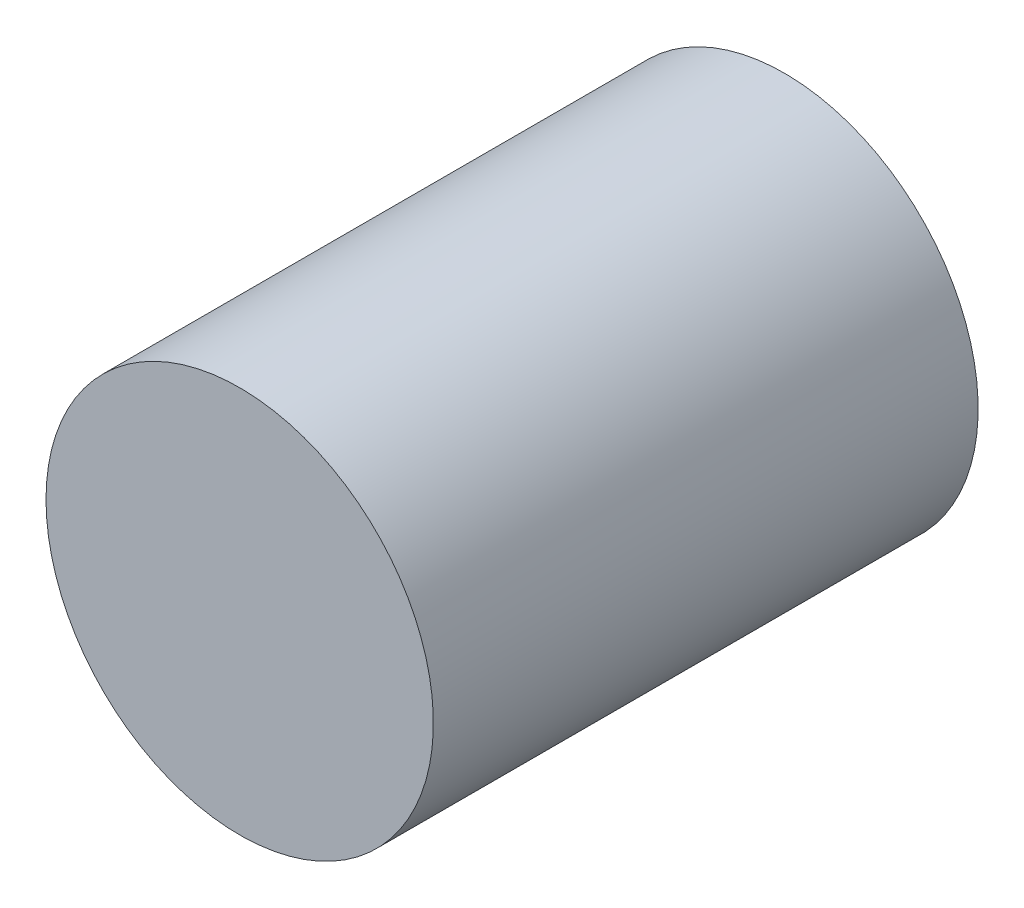
ISO-10303-21;
HEADER;
FILE_DESCRIPTION(('STEP AP214'),'2;1');
FILE_NAME('part.step','',(''),(''),'','','');
FILE_SCHEMA(('AUTOMOTIVE_DESIGN { 1 0 10303 214 1 1 1 1 }'));
ENDSEC;
DATA;
#1=APPLICATION_CONTEXT('core data for automotive mechanical design processes');
#2=APPLICATION_PROTOCOL_DEFINITION('international standard','automotive_design',2000,#1);
#3=PRODUCT_CONTEXT('',#1,'mechanical');
#4=PRODUCT('Part','Part','',(#3));
#5=PRODUCT_RELATED_PRODUCT_CATEGORY('part','',(#4));
#6=PRODUCT_DEFINITION_FORMATION('','',#4);
#7=PRODUCT_DEFINITION_CONTEXT('part definition',#1,'design');
#8=PRODUCT_DEFINITION('design','',#6,#7);
#9=PRODUCT_DEFINITION_SHAPE('','',#8);
#10=(LENGTH_UNIT() NAMED_UNIT(*) SI_UNIT(.MILLI.,.METRE.));
#11=(NAMED_UNIT(*) PLANE_ANGLE_UNIT() SI_UNIT($,.RADIAN.));
#12=(NAMED_UNIT(*) SI_UNIT($,.STERADIAN.) SOLID_ANGLE_UNIT());
#13=UNCERTAINTY_MEASURE_WITH_UNIT(LENGTH_MEASURE(1.E-05),#10,'distance_accuracy_value','');
#14=(GEOMETRIC_REPRESENTATION_CONTEXT(3) GLOBAL_UNCERTAINTY_ASSIGNED_CONTEXT((#13)) GLOBAL_UNIT_ASSIGNED_CONTEXT((#10,
#11,#12)) REPRESENTATION_CONTEXT('',''));
#15=CARTESIAN_POINT('',(0.,0.,0.));
#16=DIRECTION('',(0.,0.,1.));
#17=DIRECTION('',(1.,0.,0.));
#18=AXIS2_PLACEMENT_3D('',#15,#16,#17);
#19=CARTESIAN_POINT('',(0.,0.,45.));
#20=DIRECTION('',(0.,0.,-1.));
#21=DIRECTION('',(-1.,0.,0.));
#22=AXIS2_PLACEMENT_3D('',#19,#20,#21);
#23=CYLINDRICAL_SURFACE('',#22,16.);
#24=CARTESIAN_POINT('',(0.,0.,45.));
#25=DIRECTION('',(0.,0.,1.));
#26=DIRECTION('',(1.,0.,0.));
#27=AXIS2_PLACEMENT_3D('',#24,#25,#26);
#28=CIRCLE('',#27,16.);
#29=CARTESIAN_POINT('',(-16.,0.,45.));
#30=VERTEX_POINT('',#29);
#31=EDGE_CURVE('E10',#30,#30,#28,.T.);
#32=CARTESIAN_POINT('',(0.,0.,0.));
#33=DIRECTION('',(0.,0.,1.));
#34=DIRECTION('',(1.,0.,0.));
#35=AXIS2_PLACEMENT_3D('',#32,#33,#34);
#36=CIRCLE('',#35,16.);
#37=CARTESIAN_POINT('',(-16.,0.,0.));
#38=VERTEX_POINT('',#37);
#39=EDGE_CURVE('E36',#38,#38,#36,.T.);
#40=CARTESIAN_POINT('',(-16.,0.,45.));
#41=CARTESIAN_POINT('',(-16.,0.,44.53125));
#42=CARTESIAN_POINT('',(-16.,0.,44.0625));
#43=CARTESIAN_POINT('',(-16.,0.,43.125));
#44=CARTESIAN_POINT('',(-16.,0.,42.65625));
#45=CARTESIAN_POINT('',(-16.,0.,41.71875));
#46=CARTESIAN_POINT('',(-16.,0.,41.25));
#47=CARTESIAN_POINT('',(-16.,0.,40.3125));
#48=CARTESIAN_POINT('',(-16.,0.,39.84375));
#49=CARTESIAN_POINT('',(-16.,0.,38.90625));
#50=CARTESIAN_POINT('',(-16.,0.,38.4375));
#51=CARTESIAN_POINT('',(-16.,0.,37.5));
#52=CARTESIAN_POINT('',(-16.,0.,37.03125));
#53=CARTESIAN_POINT('',(-16.,0.,36.09375));
#54=CARTESIAN_POINT('',(-16.,0.,35.625));
#55=CARTESIAN_POINT('',(-16.,0.,34.6875));
#56=CARTESIAN_POINT('',(-16.,0.,34.21875));
#57=CARTESIAN_POINT('',(-16.,0.,33.28125));
#58=CARTESIAN_POINT('',(-16.,0.,32.8125));
#59=CARTESIAN_POINT('',(-16.,0.,31.875));
#60=CARTESIAN_POINT('',(-16.,0.,31.40625));
#61=CARTESIAN_POINT('',(-16.,0.,30.46875));
#62=CARTESIAN_POINT('',(-16.,0.,30.));
#63=CARTESIAN_POINT('',(-16.,0.,29.0625));
#64=CARTESIAN_POINT('',(-16.,0.,28.59375));
#65=CARTESIAN_POINT('',(-16.,0.,27.65625));
#66=CARTESIAN_POINT('',(-16.,0.,27.1875));
#67=CARTESIAN_POINT('',(-16.,0.,26.25));
#68=CARTESIAN_POINT('',(-16.,0.,25.78125));
#69=CARTESIAN_POINT('',(-16.,0.,24.84375));
#70=CARTESIAN_POINT('',(-16.,0.,24.375));
#71=CARTESIAN_POINT('',(-16.,0.,23.4375));
#72=CARTESIAN_POINT('',(-16.,0.,22.96875));
#73=CARTESIAN_POINT('',(-16.,0.,22.03125));
#74=CARTESIAN_POINT('',(-16.,0.,21.5625));
#75=CARTESIAN_POINT('',(-16.,0.,20.625));
#76=CARTESIAN_POINT('',(-16.,0.,20.15625));
#77=CARTESIAN_POINT('',(-16.,0.,19.21875));
#78=CARTESIAN_POINT('',(-16.,0.,18.75));
#79=CARTESIAN_POINT('',(-16.,0.,17.8125));
#80=CARTESIAN_POINT('',(-16.,0.,17.34375));
#81=CARTESIAN_POINT('',(-16.,0.,16.40625));
#82=CARTESIAN_POINT('',(-16.,0.,15.9375));
#83=CARTESIAN_POINT('',(-16.,0.,15.));
#84=CARTESIAN_POINT('',(-16.,0.,14.53125));
#85=CARTESIAN_POINT('',(-16.,0.,13.59375));
#86=CARTESIAN_POINT('',(-16.,0.,13.125));
#87=CARTESIAN_POINT('',(-16.,0.,12.1875));
#88=CARTESIAN_POINT('',(-16.,0.,11.71875));
#89=CARTESIAN_POINT('',(-16.,0.,10.78125));
#90=CARTESIAN_POINT('',(-16.,0.,10.3125));
#91=CARTESIAN_POINT('',(-16.,0.,9.375));
#92=CARTESIAN_POINT('',(-16.,0.,8.90625));
#93=CARTESIAN_POINT('',(-16.,0.,7.96874999999999));
#94=CARTESIAN_POINT('',(-16.,0.,7.5));
#95=CARTESIAN_POINT('',(-16.,0.,6.5625));
#96=CARTESIAN_POINT('',(-16.,0.,6.09375));
#97=CARTESIAN_POINT('',(-16.,0.,5.15625));
#98=CARTESIAN_POINT('',(-16.,0.,4.68749999999999));
#99=CARTESIAN_POINT('',(-16.,0.,3.74999999999999));
#100=CARTESIAN_POINT('',(-16.,0.,3.28124999999999));
#101=CARTESIAN_POINT('',(-16.,0.,2.34374999999999));
#102=CARTESIAN_POINT('',(-16.,0.,1.87499999999999));
#103=CARTESIAN_POINT('',(-16.,0.,0.937499999999992));
#104=CARTESIAN_POINT('',(-16.,0.,0.468749999999993));
#105=CARTESIAN_POINT('',(-16.,0.,0.));
#106=B_SPLINE_CURVE_WITH_KNOTS('',3,(#40,#41,#42,#43,#44,#45,#46,#47,#48,#49,#50,#51,#52,#53,
#54,#55,#56,#57,#58,#59,#60,#61,#62,#63,#64,#65,#66,#67,#68,#69,#70,#71,#72,#73,#74,#75,#76,#77,
#78,#79,#80,#81,#82,#83,#84,#85,#86,#87,#88,#89,#90,#91,#92,#93,#94,#95,#96,#97,#98,#99,#100,
#101,#102,#103,#104,#105),.UNSPECIFIED.,.F.,.F.,(4,2,2,2,2,2,2,2,2,2,2,2,2,2,2,2,2,2,2,2,2,2,2,
2,2,2,2,2,2,2,2,2,4),(0.,1.40625,2.8125,4.21875000000001,5.62500000000001,7.03125,8.4375,
9.84375000000001,11.25,12.65625,14.0625,15.46875,16.875,18.28125,19.6875,21.09375,22.5,23.90625,
25.3125,26.71875,28.125,29.53125,30.9375,32.34375,33.75,35.15625,36.5625,37.96875,39.375,
40.78125,42.1875,43.59375,45.),.UNSPECIFIED.);
#107=EDGE_CURVE('BSEAM33',#30,#38,#106,.T.);
#108=ORIENTED_EDGE('',*,*,#31,.F.);
#109=ORIENTED_EDGE('',*,*,#39,.T.);
#110=ORIENTED_EDGE('',*,*,#107,.T.);
#111=ORIENTED_EDGE('',*,*,#107,.F.);
#112=EDGE_LOOP('',(#108,#110,#109,#111));
#113=FACE_BOUND('',#112,.T.);
#114=ADVANCED_FACE('F33',(#113),#23,.T.);
#115=CARTESIAN_POINT('',(0.,0.,45.));
#116=DIRECTION('',(0.,0.,1.));
#117=DIRECTION('',(1.,0.,0.));
#118=AXIS2_PLACEMENT_3D('',#115,#116,#117);
#119=PLANE('',#118);
#120=ORIENTED_EDGE('',*,*,#31,.T.);
#121=EDGE_LOOP('',(#120));
#122=FACE_BOUND('',#121,.T.);
#123=ADVANCED_FACE('F48',(#122),#119,.T.);
#124=CARTESIAN_POINT('',(0.,0.,0.));
#125=DIRECTION('',(0.,0.,1.));
#126=DIRECTION('',(1.,0.,0.));
#127=AXIS2_PLACEMENT_3D('',#124,#125,#126);
#128=PLANE('',#127);
#129=ORIENTED_EDGE('',*,*,#39,.F.);
#130=EDGE_LOOP('',(#129));
#131=FACE_BOUND('',#130,.T.);
#132=ADVANCED_FACE('F46',(#131),#128,.F.);
#133=CLOSED_SHELL('',(#114,#123,#132));
#134=MANIFOLD_SOLID_BREP('B2',#133);
#135=ADVANCED_BREP_SHAPE_REPRESENTATION('',(#18,#134),#14);
#136=SHAPE_DEFINITION_REPRESENTATION(#9,#135);
ENDSEC;
END-ISO-10303-21;
